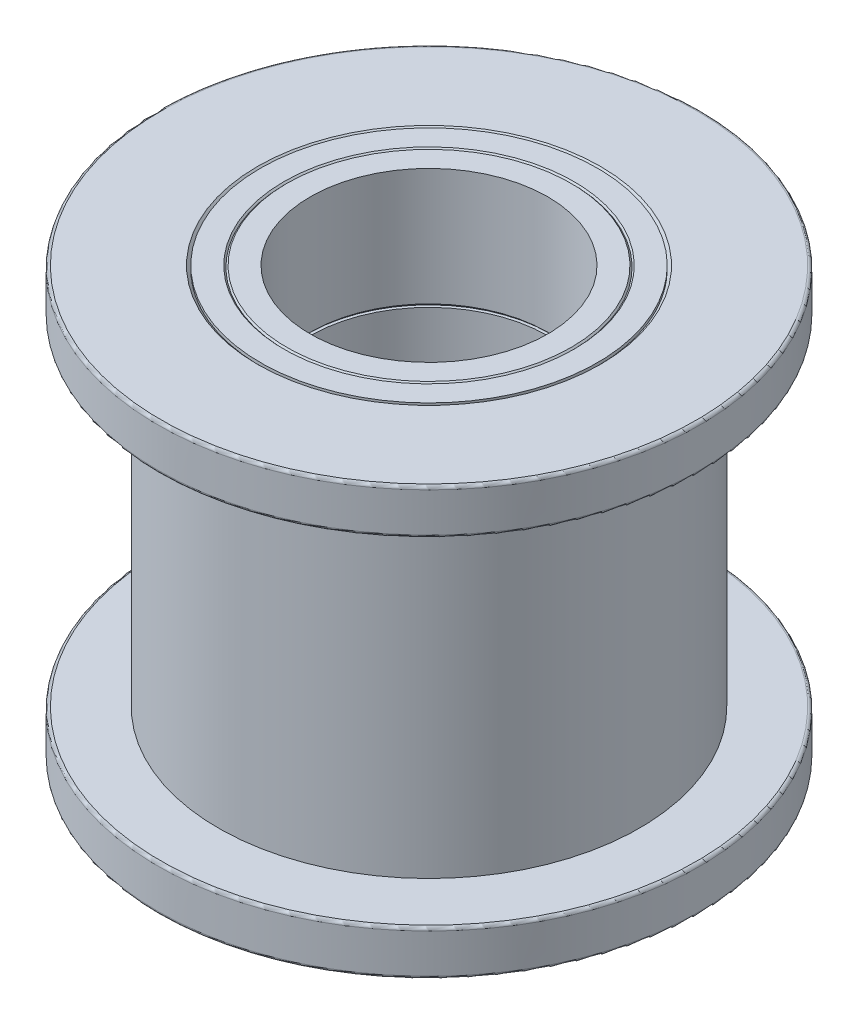
ISO-10303-21;
HEADER;
FILE_DESCRIPTION(('STEP AP214'),'2;1');
FILE_NAME('part.step','',(''),(''),'','','');
FILE_SCHEMA(('AUTOMOTIVE_DESIGN { 1 0 10303 214 1 1 1 1 }'));
ENDSEC;
DATA;
#1=APPLICATION_CONTEXT('core data for automotive mechanical design processes');
#2=APPLICATION_PROTOCOL_DEFINITION('international standard','automotive_design',2000,#1);
#3=PRODUCT_CONTEXT('',#1,'mechanical');
#4=PRODUCT('Part','Part','',(#3));
#5=PRODUCT_RELATED_PRODUCT_CATEGORY('part','',(#4));
#6=PRODUCT_DEFINITION_FORMATION('','',#4);
#7=PRODUCT_DEFINITION_CONTEXT('part definition',#1,'design');
#8=PRODUCT_DEFINITION('design','',#6,#7);
#9=PRODUCT_DEFINITION_SHAPE('','',#8);
#10=(LENGTH_UNIT() NAMED_UNIT(*) SI_UNIT(.MILLI.,.METRE.));
#11=(NAMED_UNIT(*) PLANE_ANGLE_UNIT() SI_UNIT($,.RADIAN.));
#12=(NAMED_UNIT(*) SI_UNIT($,.STERADIAN.) SOLID_ANGLE_UNIT());
#13=UNCERTAINTY_MEASURE_WITH_UNIT(LENGTH_MEASURE(1.E-05),#10,'distance_accuracy_value','');
#14=(GEOMETRIC_REPRESENTATION_CONTEXT(3) GLOBAL_UNCERTAINTY_ASSIGNED_CONTEXT((#13)) GLOBAL_UNIT_ASSIGNED_CONTEXT((#10,
#11,#12)) REPRESENTATION_CONTEXT('',''));
#15=CARTESIAN_POINT('',(0.,0.,0.));
#16=DIRECTION('',(0.,0.,1.));
#17=DIRECTION('',(1.,0.,0.));
#18=AXIS2_PLACEMENT_3D('',#15,#16,#17);
#19=CARTESIAN_POINT('',(0.,4.,0.));
#20=DIRECTION('',(0.,-1.,0.));
#21=DIRECTION('',(-1.,0.,0.));
#22=AXIS2_PLACEMENT_3D('',#19,#20,#21);
#23=PLANE('',#22);
#24=CARTESIAN_POINT('',(0.,4.,0.));
#25=DIRECTION('',(0.,1.,0.));
#26=DIRECTION('',(0.,0.,1.));
#27=AXIS2_PLACEMENT_3D('',#24,#25,#26);
#28=CIRCLE('',#27,3.95);
#29=CARTESIAN_POINT('',(0.,4.,-3.95));
#30=VERTEX_POINT('',#29);
#31=EDGE_CURVE('P0_E58',#30,#30,#28,.T.);
#32=ORIENTED_EDGE('',*,*,#31,.T.);
#33=EDGE_LOOP('',(#32));
#34=FACE_BOUND('',#33,.T.);
#35=CARTESIAN_POINT('',(0.,4.,0.));
#36=DIRECTION('',(0.,-1.,0.));
#37=DIRECTION('',(1.,0.,0.));
#38=AXIS2_PLACEMENT_3D('',#35,#36,#37);
#39=CIRCLE('',#38,5.6);
#40=CARTESIAN_POINT('',(-5.6,4.,0.));
#41=VERTEX_POINT('',#40);
#42=EDGE_CURVE('P0_E11',#41,#41,#39,.T.);
#43=ORIENTED_EDGE('',*,*,#42,.T.);
#44=EDGE_LOOP('',(#43));
#45=FACE_BOUND('',#44,.T.);
#46=ADVANCED_FACE('P0_F17',(#34,#45),#23,.T.);
#47=CARTESIAN_POINT('',(0.,7.1,0.));
#48=DIRECTION('',(0.,1.,0.));
#49=DIRECTION('',(1.,0.,0.));
#50=AXIS2_PLACEMENT_3D('',#47,#48,#49);
#51=CYLINDRICAL_SURFACE('',#50,5.6);
#52=CARTESIAN_POINT('',(0.,10.2,0.));
#53=DIRECTION('',(0.,1.,0.));
#54=DIRECTION('',(1.,0.,0.));
#55=AXIS2_PLACEMENT_3D('',#52,#53,#54);
#56=CIRCLE('',#55,5.6);
#57=CARTESIAN_POINT('',(-5.6,10.2,0.));
#58=VERTEX_POINT('',#57);
#59=EDGE_CURVE('P0_E65',#58,#58,#56,.T.);
#60=ORIENTED_EDGE('',*,*,#59,.F.);
#61=DIRECTION('',(0.,-1.,0.));
#62=VECTOR('',#61,1.);
#63=CARTESIAN_POINT('',(-5.6,7.1,0.));
#64=LINE('',#63,#62);
#65=EDGE_CURVE('P0_E25',#58,#41,#64,.T.);
#66=ORIENTED_EDGE('',*,*,#65,.T.);
#67=ORIENTED_EDGE('',*,*,#42,.F.);
#68=ORIENTED_EDGE('',*,*,#65,.F.);
#69=EDGE_LOOP('',(#60,#66,#67,#68));
#70=FACE_BOUND('',#69,.T.);
#71=ADVANCED_FACE('P0_F74',(#70),#51,.T.);
#72=CARTESIAN_POINT('',(0.,10.2,0.));
#73=DIRECTION('',(0.,1.,0.));
#74=DIRECTION('',(0.,0.,-1.));
#75=AXIS2_PLACEMENT_3D('',#72,#73,#74);
#76=PLANE('',#75);
#77=CARTESIAN_POINT('',(0.,10.2,0.));
#78=DIRECTION('',(0.,1.,0.));
#79=DIRECTION('',(0.,0.,1.));
#80=AXIS2_PLACEMENT_3D('',#77,#78,#79);
#81=CIRCLE('',#80,3.95);
#82=CARTESIAN_POINT('',(0.,10.2,-3.95));
#83=VERTEX_POINT('',#82);
#84=EDGE_CURVE('P0_E57',#83,#83,#81,.T.);
#85=ORIENTED_EDGE('',*,*,#84,.F.);
#86=EDGE_LOOP('',(#85));
#87=FACE_BOUND('',#86,.T.);
#88=ORIENTED_EDGE('',*,*,#59,.T.);
#89=EDGE_LOOP('',(#88));
#90=FACE_BOUND('',#89,.T.);
#91=ADVANCED_FACE('P0_F76',(#87,#90),#76,.T.);
#92=CARTESIAN_POINT('',(0.,7.1,0.));
#93=DIRECTION('',(0.,-1.,0.));
#94=DIRECTION('',(0.,0.,1.));
#95=AXIS2_PLACEMENT_3D('',#92,#93,#94);
#96=CYLINDRICAL_SURFACE('',#95,3.95);
#97=ORIENTED_EDGE('',*,*,#84,.T.);
#98=DIRECTION('',(0.,-1.,0.));
#99=VECTOR('',#98,1.);
#100=CARTESIAN_POINT('',(0.,7.1,-3.95));
#101=LINE('',#100,#99);
#102=EDGE_CURVE('P0_E54',#83,#30,#101,.T.);
#103=ORIENTED_EDGE('',*,*,#102,.T.);
#104=ORIENTED_EDGE('',*,*,#31,.F.);
#105=ORIENTED_EDGE('',*,*,#102,.F.);
#106=EDGE_LOOP('',(#97,#103,#104,#105));
#107=FACE_BOUND('',#106,.T.);
#108=ADVANCED_FACE('P0_F55',(#107),#96,.F.);
#109=CLOSED_SHELL('',(#46,#71,#91,#108));
#110=MANIFOLD_SOLID_BREP('P0_B1',#109);
#111=CARTESIAN_POINT('',(0.,14.2,0.));
#112=DIRECTION('',(0.,1.,0.));
#113=DIRECTION('',(0.,0.,-1.));
#114=AXIS2_PLACEMENT_3D('',#111,#112,#113);
#115=PLANE('',#114);
#116=CARTESIAN_POINT('',(0.,14.2,0.));
#117=DIRECTION('',(0.,-1.,0.));
#118=DIRECTION('',(0.,0.,1.));
#119=AXIS2_PLACEMENT_3D('',#116,#117,#118);
#120=CIRCLE('',#119,3.95);
#121=CARTESIAN_POINT('',(0.,14.2,-3.95));
#122=VERTEX_POINT('',#121);
#123=EDGE_CURVE('P1_E62',#122,#122,#120,.T.);
#124=ORIENTED_EDGE('',*,*,#123,.T.);
#125=EDGE_LOOP('',(#124));
#126=FACE_BOUND('',#125,.T.);
#127=CARTESIAN_POINT('',(0.,14.2,0.));
#128=DIRECTION('',(0.,-1.,0.));
#129=DIRECTION('',(-1.,0.,0.));
#130=AXIS2_PLACEMENT_3D('',#127,#128,#129);
#131=CIRCLE('',#130,4.72462639589585);
#132=CARTESIAN_POINT('',(4.72462639589585,14.2,0.));
#133=VERTEX_POINT('',#132);
#134=EDGE_CURVE('P1_E11',#133,#133,#131,.T.);
#135=ORIENTED_EDGE('',*,*,#134,.F.);
#136=EDGE_LOOP('',(#135));
#137=FACE_BOUND('',#136,.T.);
#138=ADVANCED_FACE('P1_F17',(#126,#137),#115,.T.);
#139=CARTESIAN_POINT('',(0.,14.175,0.));
#140=DIRECTION('',(0.,-1.,0.));
#141=DIRECTION('',(-1.,0.,0.));
#142=AXIS2_PLACEMENT_3D('',#139,#140,#141);
#143=CONICAL_SURFACE('',#142,4.74962639589585,0.785398163397459);
#144=CARTESIAN_POINT('',(0.,14.15,0.));
#145=DIRECTION('',(0.,1.,0.));
#146=DIRECTION('',(-1.,0.,0.));
#147=AXIS2_PLACEMENT_3D('',#144,#145,#146);
#148=CIRCLE('',#147,4.77462639589585);
#149=CARTESIAN_POINT('',(4.77462639589585,14.15,0.));
#150=VERTEX_POINT('',#149);
#151=EDGE_CURVE('P1_E64',#150,#150,#148,.T.);
#152=ORIENTED_EDGE('',*,*,#151,.T.);
#153=DIRECTION('',(-0.707106781186555,0.70710678118654,0.));
#154=VECTOR('',#153,1.);
#155=CARTESIAN_POINT('',(4.74962639589585,14.175,0.));
#156=LINE('',#155,#154);
#157=EDGE_CURVE('P1_E26',#150,#133,#156,.T.);
#158=ORIENTED_EDGE('',*,*,#157,.T.);
#159=ORIENTED_EDGE('',*,*,#134,.T.);
#160=ORIENTED_EDGE('',*,*,#157,.F.);
#161=EDGE_LOOP('',(#152,#158,#159,#160));
#162=FACE_BOUND('',#161,.T.);
#163=ADVANCED_FACE('P1_F96',(#162),#143,.T.);
#164=CARTESIAN_POINT('',(0.,14.2,0.));
#165=DIRECTION('',(0.,1.,0.));
#166=DIRECTION('',(-1.,0.,0.));
#167=AXIS2_PLACEMENT_3D('',#164,#165,#166);
#168=CYLINDRICAL_SURFACE('',#167,4.77462639589585);
#169=ORIENTED_EDGE('',*,*,#151,.F.);
#170=DIRECTION('',(0.,-1.,0.));
#171=VECTOR('',#170,1.);
#172=CARTESIAN_POINT('',(4.77462639589585,14.2,0.));
#173=LINE('',#172,#171);
#174=CARTESIAN_POINT('',(4.77462639589585,10.2,0.));
#175=VERTEX_POINT('',#174);
#176=EDGE_CURVE('P1_E91',#150,#175,#173,.T.);
#177=ORIENTED_EDGE('',*,*,#176,.T.);
#178=CARTESIAN_POINT('',(0.,10.2,0.));
#179=DIRECTION('',(0.,1.,0.));
#180=DIRECTION('',(-1.,0.,0.));
#181=AXIS2_PLACEMENT_3D('',#178,#179,#180);
#182=CIRCLE('',#181,4.77462639589585);
#183=EDGE_CURVE('P1_E79',#175,#175,#182,.T.);
#184=ORIENTED_EDGE('',*,*,#183,.T.);
#185=ORIENTED_EDGE('',*,*,#176,.F.);
#186=EDGE_LOOP('',(#169,#177,#184,#185));
#187=FACE_BOUND('',#186,.T.);
#188=ADVANCED_FACE('P1_F100',(#187),#168,.T.);
#189=CARTESIAN_POINT('',(0.,7.1,0.));
#190=DIRECTION('',(0.,-1.,0.));
#191=DIRECTION('',(0.,0.,1.));
#192=AXIS2_PLACEMENT_3D('',#189,#190,#191);
#193=CYLINDRICAL_SURFACE('',#192,3.95);
#194=ORIENTED_EDGE('',*,*,#123,.F.);
#195=DIRECTION('',(0.,-1.,0.));
#196=VECTOR('',#195,1.);
#197=CARTESIAN_POINT('',(0.,7.1,-3.95));
#198=LINE('',#197,#196);
#199=CARTESIAN_POINT('',(0.,10.3,-3.95));
#200=VERTEX_POINT('',#199);
#201=EDGE_CURVE('P1_E56',#122,#200,#198,.T.);
#202=ORIENTED_EDGE('',*,*,#201,.T.);
#203=CARTESIAN_POINT('',(0.,10.3,0.));
#204=DIRECTION('',(0.,1.,0.));
#205=DIRECTION('',(0.,0.,1.));
#206=AXIS2_PLACEMENT_3D('',#203,#204,#205);
#207=CIRCLE('',#206,3.95);
#208=EDGE_CURVE('P1_E60',#200,#200,#207,.T.);
#209=ORIENTED_EDGE('',*,*,#208,.F.);
#210=ORIENTED_EDGE('',*,*,#201,.F.);
#211=EDGE_LOOP('',(#194,#202,#209,#210));
#212=FACE_BOUND('',#211,.T.);
#213=ADVANCED_FACE('P1_F58',(#212),#193,.F.);
#214=CARTESIAN_POINT('',(0.,10.2,0.));
#215=DIRECTION('',(0.,1.,0.));
#216=DIRECTION('',(0.,0.,-1.));
#217=AXIS2_PLACEMENT_3D('',#214,#215,#216);
#218=PLANE('',#217);
#219=CARTESIAN_POINT('',(0.,10.2,0.));
#220=DIRECTION('',(0.,-1.,0.));
#221=DIRECTION('',(0.,0.,1.));
#222=AXIS2_PLACEMENT_3D('',#219,#220,#221);
#223=CIRCLE('',#222,4.05);
#224=CARTESIAN_POINT('',(0.,10.2,-4.05));
#225=VERTEX_POINT('',#224);
#226=EDGE_CURVE('P1_E71',#225,#225,#223,.T.);
#227=ORIENTED_EDGE('',*,*,#226,.F.);
#228=EDGE_LOOP('',(#227));
#229=FACE_BOUND('',#228,.T.);
#230=ORIENTED_EDGE('',*,*,#183,.F.);
#231=EDGE_LOOP('',(#230));
#232=FACE_BOUND('',#231,.T.);
#233=ADVANCED_FACE('P1_F103',(#229,#232),#218,.F.);
#234=CARTESIAN_POINT('',(0.,10.25,0.));
#235=DIRECTION('',(0.,-1.,0.));
#236=DIRECTION('',(0.,0.,1.));
#237=AXIS2_PLACEMENT_3D('',#234,#235,#236);
#238=CONICAL_SURFACE('',#237,4.,0.785398163397459);
#239=ORIENTED_EDGE('',*,*,#208,.T.);
#240=DIRECTION('',(0.,-0.70710678118654,-0.707106781186555));
#241=VECTOR('',#240,1.);
#242=CARTESIAN_POINT('',(0.,10.25,-4.));
#243=LINE('',#242,#241);
#244=EDGE_CURVE('P1_E68',#200,#225,#243,.T.);
#245=ORIENTED_EDGE('',*,*,#244,.T.);
#246=ORIENTED_EDGE('',*,*,#226,.T.);
#247=ORIENTED_EDGE('',*,*,#244,.F.);
#248=EDGE_LOOP('',(#239,#245,#246,#247));
#249=FACE_BOUND('',#248,.T.);
#250=ADVANCED_FACE('P1_F69',(#249),#238,.F.);
#251=CLOSED_SHELL('',(#138,#163,#188,#213,#233,#250));
#252=MANIFOLD_SOLID_BREP('P1_B1',#251);
#253=CARTESIAN_POINT('',(0.,14.2,0.));
#254=DIRECTION('',(0.,1.,0.));
#255=DIRECTION('',(0.,0.,-1.));
#256=AXIS2_PLACEMENT_3D('',#253,#254,#255);
#257=PLANE('',#256);
#258=CARTESIAN_POINT('',(0.,14.2,0.));
#259=DIRECTION('',(0.,1.,0.));
#260=DIRECTION('',(-1.,0.,0.));
#261=AXIS2_PLACEMENT_3D('',#258,#259,#260);
#262=CIRCLE('',#261,4.82462639589585);
#263=CARTESIAN_POINT('',(4.82462639589585,14.2,0.));
#264=VERTEX_POINT('',#263);
#265=EDGE_CURVE('P2_E26',#264,#264,#262,.T.);
#266=ORIENTED_EDGE('',*,*,#265,.F.);
#267=EDGE_LOOP('',(#266));
#268=FACE_BOUND('',#267,.T.);
#269=CARTESIAN_POINT('',(0.,14.2,0.));
#270=DIRECTION('',(0.,1.,0.));
#271=DIRECTION('',(1.,0.,0.));
#272=AXIS2_PLACEMENT_3D('',#269,#270,#271);
#273=CIRCLE('',#272,5.6);
#274=CARTESIAN_POINT('',(-5.6,14.2,0.));
#275=VERTEX_POINT('',#274);
#276=EDGE_CURVE('P2_E61',#275,#275,#273,.T.);
#277=ORIENTED_EDGE('',*,*,#276,.T.);
#278=EDGE_LOOP('',(#277));
#279=FACE_BOUND('',#278,.T.);
#280=ADVANCED_FACE('P2_F17',(#268,#279),#257,.T.);
#281=CARTESIAN_POINT('',(0.,14.175,0.));
#282=DIRECTION('',(0.,1.,0.));
#283=DIRECTION('',(-1.,0.,0.));
#284=AXIS2_PLACEMENT_3D('',#281,#282,#283);
#285=CONICAL_SURFACE('',#284,4.79962639589585,0.785398163397459);
#286=ORIENTED_EDGE('',*,*,#265,.T.);
#287=DIRECTION('',(-0.707106781186555,-0.70710678118654,0.));
#288=VECTOR('',#287,1.);
#289=CARTESIAN_POINT('',(4.79962639589585,14.175,0.));
#290=LINE('',#289,#288);
#291=CARTESIAN_POINT('',(4.77462639589585,14.15,0.));
#292=VERTEX_POINT('',#291);
#293=EDGE_CURVE('P2_E11',#264,#292,#290,.T.);
#294=ORIENTED_EDGE('',*,*,#293,.T.);
#295=CARTESIAN_POINT('',(0.,14.15,0.));
#296=DIRECTION('',(0.,-1.,0.));
#297=DIRECTION('',(-1.,0.,0.));
#298=AXIS2_PLACEMENT_3D('',#295,#296,#297);
#299=CIRCLE('',#298,4.77462639589585);
#300=EDGE_CURVE('P2_E70',#292,#292,#299,.T.);
#301=ORIENTED_EDGE('',*,*,#300,.T.);
#302=ORIENTED_EDGE('',*,*,#293,.F.);
#303=EDGE_LOOP('',(#286,#294,#301,#302));
#304=FACE_BOUND('',#303,.T.);
#305=ADVANCED_FACE('P2_F82',(#304),#285,.F.);
#306=CARTESIAN_POINT('',(0.,14.2,0.));
#307=DIRECTION('',(0.,1.,0.));
#308=DIRECTION('',(-1.,0.,0.));
#309=AXIS2_PLACEMENT_3D('',#306,#307,#308);
#310=CYLINDRICAL_SURFACE('',#309,4.77462639589585);
#311=CARTESIAN_POINT('',(0.,10.2,0.));
#312=DIRECTION('',(0.,-1.,0.));
#313=DIRECTION('',(-1.,0.,0.));
#314=AXIS2_PLACEMENT_3D('',#311,#312,#313);
#315=CIRCLE('',#314,4.77462639589585);
#316=CARTESIAN_POINT('',(4.77462639589585,10.2,0.));
#317=VERTEX_POINT('',#316);
#318=EDGE_CURVE('P2_E71',#317,#317,#315,.T.);
#319=ORIENTED_EDGE('',*,*,#318,.T.);
#320=DIRECTION('',(0.,1.,0.));
#321=VECTOR('',#320,1.);
#322=CARTESIAN_POINT('',(4.77462639589585,14.2,0.));
#323=LINE('',#322,#321);
#324=EDGE_CURVE('P2_E20',#317,#292,#323,.T.);
#325=ORIENTED_EDGE('',*,*,#324,.T.);
#326=ORIENTED_EDGE('',*,*,#300,.F.);
#327=ORIENTED_EDGE('',*,*,#324,.F.);
#328=EDGE_LOOP('',(#319,#325,#326,#327));
#329=FACE_BOUND('',#328,.T.);
#330=ADVANCED_FACE('P2_F85',(#329),#310,.F.);
#331=CARTESIAN_POINT('',(0.,7.1,0.));
#332=DIRECTION('',(0.,1.,0.));
#333=DIRECTION('',(1.,0.,0.));
#334=AXIS2_PLACEMENT_3D('',#331,#332,#333);
#335=CYLINDRICAL_SURFACE('',#334,5.6);
#336=ORIENTED_EDGE('',*,*,#276,.F.);
#337=DIRECTION('',(0.,-1.,0.));
#338=VECTOR('',#337,1.);
#339=CARTESIAN_POINT('',(-5.6,7.1,0.));
#340=LINE('',#339,#338);
#341=CARTESIAN_POINT('',(-5.6,10.2,0.));
#342=VERTEX_POINT('',#341);
#343=EDGE_CURVE('P2_E56',#275,#342,#340,.T.);
#344=ORIENTED_EDGE('',*,*,#343,.T.);
#345=CARTESIAN_POINT('',(0.,10.2,0.));
#346=DIRECTION('',(0.,1.,0.));
#347=DIRECTION('',(1.,0.,0.));
#348=AXIS2_PLACEMENT_3D('',#345,#346,#347);
#349=CIRCLE('',#348,5.6);
#350=EDGE_CURVE('P2_E59',#342,#342,#349,.T.);
#351=ORIENTED_EDGE('',*,*,#350,.T.);
#352=ORIENTED_EDGE('',*,*,#343,.F.);
#353=EDGE_LOOP('',(#336,#344,#351,#352));
#354=FACE_BOUND('',#353,.T.);
#355=ADVANCED_FACE('P2_F57',(#354),#335,.T.);
#356=CARTESIAN_POINT('',(0.,10.2,0.));
#357=DIRECTION('',(0.,1.,0.));
#358=DIRECTION('',(0.,0.,-1.));
#359=AXIS2_PLACEMENT_3D('',#356,#357,#358);
#360=PLANE('',#359);
#361=ORIENTED_EDGE('',*,*,#318,.F.);
#362=EDGE_LOOP('',(#361));
#363=FACE_BOUND('',#362,.T.);
#364=ORIENTED_EDGE('',*,*,#350,.F.);
#365=EDGE_LOOP('',(#364));
#366=FACE_BOUND('',#365,.T.);
#367=ADVANCED_FACE('P2_F115',(#363,#366),#360,.F.);
#368=CLOSED_SHELL('',(#280,#305,#330,#355,#367));
#369=MANIFOLD_SOLID_BREP('P2_B1',#368);
#370=CARTESIAN_POINT('',(0.,14.2,0.));
#371=DIRECTION('',(0.,1.,0.));
#372=DIRECTION('',(-1.,0.,0.));
#373=AXIS2_PLACEMENT_3D('',#370,#371,#372);
#374=CYLINDRICAL_SURFACE('',#373,4.77462639589585);
#375=CARTESIAN_POINT('',(0.,4.,0.));
#376=DIRECTION('',(0.,-1.,0.));
#377=DIRECTION('',(-1.,0.,0.));
#378=AXIS2_PLACEMENT_3D('',#375,#376,#377);
#379=CIRCLE('',#378,4.77462639589585);
#380=CARTESIAN_POINT('',(4.77462639589585,4.,0.));
#381=VERTEX_POINT('',#380);
#382=EDGE_CURVE('P3_E71',#381,#381,#379,.T.);
#383=ORIENTED_EDGE('',*,*,#382,.T.);
#384=DIRECTION('',(0.,-1.,0.));
#385=VECTOR('',#384,1.);
#386=CARTESIAN_POINT('',(4.77462639589585,14.2,0.));
#387=LINE('',#386,#385);
#388=CARTESIAN_POINT('',(4.77462639589585,0.0499999999999989,0.));
#389=VERTEX_POINT('',#388);
#390=EDGE_CURVE('P3_E11',#381,#389,#387,.T.);
#391=ORIENTED_EDGE('',*,*,#390,.T.);
#392=CARTESIAN_POINT('',(0.,0.0499999999999989,0.));
#393=DIRECTION('',(0.,-1.,0.));
#394=DIRECTION('',(-1.,0.,0.));
#395=AXIS2_PLACEMENT_3D('',#392,#393,#394);
#396=CIRCLE('',#395,4.77462639589585);
#397=EDGE_CURVE('P3_E92',#389,#389,#396,.T.);
#398=ORIENTED_EDGE('',*,*,#397,.F.);
#399=ORIENTED_EDGE('',*,*,#390,.F.);
#400=EDGE_LOOP('',(#383,#391,#398,#399));
#401=FACE_BOUND('',#400,.T.);
#402=ADVANCED_FACE('P3_F17',(#401),#374,.T.);
#403=CARTESIAN_POINT('',(0.,0.0249999999999995,0.));
#404=DIRECTION('',(0.,1.,0.));
#405=DIRECTION('',(-1.,0.,0.));
#406=AXIS2_PLACEMENT_3D('',#403,#404,#405);
#407=CONICAL_SURFACE('',#406,4.74962639589585,0.785398163397459);
#408=ORIENTED_EDGE('',*,*,#397,.T.);
#409=DIRECTION('',(-0.707106781186555,-0.70710678118654,0.));
#410=VECTOR('',#409,1.);
#411=CARTESIAN_POINT('',(4.74962639589585,0.0249999999999995,0.));
#412=LINE('',#411,#410);
#413=CARTESIAN_POINT('',(4.72462639589585,0.,0.));
#414=VERTEX_POINT('',#413);
#415=EDGE_CURVE('P3_E20',#389,#414,#412,.T.);
#416=ORIENTED_EDGE('',*,*,#415,.T.);
#417=CARTESIAN_POINT('',(0.,0.,0.));
#418=DIRECTION('',(0.,1.,0.));
#419=DIRECTION('',(-1.,0.,0.));
#420=AXIS2_PLACEMENT_3D('',#417,#418,#419);
#421=CIRCLE('',#420,4.72462639589585);
#422=EDGE_CURVE('P3_E89',#414,#414,#421,.T.);
#423=ORIENTED_EDGE('',*,*,#422,.T.);
#424=ORIENTED_EDGE('',*,*,#415,.F.);
#425=EDGE_LOOP('',(#408,#416,#423,#424));
#426=FACE_BOUND('',#425,.T.);
#427=ADVANCED_FACE('P3_F102',(#426),#407,.T.);
#428=CARTESIAN_POINT('',(0.,0.,0.));
#429=DIRECTION('',(0.,-1.,0.));
#430=DIRECTION('',(-1.,0.,0.));
#431=AXIS2_PLACEMENT_3D('',#428,#429,#430);
#432=PLANE('',#431);
#433=CARTESIAN_POINT('',(0.,0.,0.));
#434=DIRECTION('',(0.,1.,0.));
#435=DIRECTION('',(0.,0.,1.));
#436=AXIS2_PLACEMENT_3D('',#433,#434,#435);
#437=CIRCLE('',#436,3.95);
#438=CARTESIAN_POINT('',(0.,0.,-3.95));
#439=VERTEX_POINT('',#438);
#440=EDGE_CURVE('P3_E69',#439,#439,#437,.T.);
#441=ORIENTED_EDGE('',*,*,#440,.T.);
#442=EDGE_LOOP('',(#441));
#443=FACE_BOUND('',#442,.T.);
#444=ORIENTED_EDGE('',*,*,#422,.F.);
#445=EDGE_LOOP('',(#444));
#446=FACE_BOUND('',#445,.T.);
#447=ADVANCED_FACE('P3_F99',(#443,#446),#432,.T.);
#448=CARTESIAN_POINT('',(0.,7.1,0.));
#449=DIRECTION('',(0.,-1.,0.));
#450=DIRECTION('',(0.,0.,1.));
#451=AXIS2_PLACEMENT_3D('',#448,#449,#450);
#452=CYLINDRICAL_SURFACE('',#451,3.95);
#453=CARTESIAN_POINT('',(0.,3.9,0.));
#454=DIRECTION('',(0.,-1.,0.));
#455=DIRECTION('',(0.,0.,1.));
#456=AXIS2_PLACEMENT_3D('',#453,#454,#455);
#457=CIRCLE('',#456,3.95);
#458=CARTESIAN_POINT('',(0.,3.9,-3.95));
#459=VERTEX_POINT('',#458);
#460=EDGE_CURVE('P3_E68',#459,#459,#457,.T.);
#461=ORIENTED_EDGE('',*,*,#460,.F.);
#462=DIRECTION('',(0.,-1.,0.));
#463=VECTOR('',#462,1.);
#464=CARTESIAN_POINT('',(0.,7.1,-3.95));
#465=LINE('',#464,#463);
#466=EDGE_CURVE('P3_E64',#459,#439,#465,.T.);
#467=ORIENTED_EDGE('',*,*,#466,.T.);
#468=ORIENTED_EDGE('',*,*,#440,.F.);
#469=ORIENTED_EDGE('',*,*,#466,.F.);
#470=EDGE_LOOP('',(#461,#467,#468,#469));
#471=FACE_BOUND('',#470,.T.);
#472=ADVANCED_FACE('P3_F66',(#471),#452,.F.);
#473=CARTESIAN_POINT('',(0.,4.,0.));
#474=DIRECTION('',(0.,-1.,0.));
#475=DIRECTION('',(-1.,0.,0.));
#476=AXIS2_PLACEMENT_3D('',#473,#474,#475);
#477=PLANE('',#476);
#478=CARTESIAN_POINT('',(0.,4.,0.));
#479=DIRECTION('',(0.,1.,0.));
#480=DIRECTION('',(0.,0.,1.));
#481=AXIS2_PLACEMENT_3D('',#478,#479,#480);
#482=CIRCLE('',#481,4.05);
#483=CARTESIAN_POINT('',(0.,4.,-4.05));
#484=VERTEX_POINT('',#483);
#485=EDGE_CURVE('P3_E77',#484,#484,#482,.T.);
#486=ORIENTED_EDGE('',*,*,#485,.F.);
#487=EDGE_LOOP('',(#486));
#488=FACE_BOUND('',#487,.T.);
#489=ORIENTED_EDGE('',*,*,#382,.F.);
#490=EDGE_LOOP('',(#489));
#491=FACE_BOUND('',#490,.T.);
#492=ADVANCED_FACE('P3_F135',(#488,#491),#477,.F.);
#493=CARTESIAN_POINT('',(0.,3.95,0.));
#494=DIRECTION('',(0.,1.,0.));
#495=DIRECTION('',(0.,0.,1.));
#496=AXIS2_PLACEMENT_3D('',#493,#494,#495);
#497=CONICAL_SURFACE('',#496,4.,0.785398163397448);
#498=ORIENTED_EDGE('',*,*,#460,.T.);
#499=DIRECTION('',(0.,0.707106781186547,-0.707106781186548));
#500=VECTOR('',#499,1.);
#501=CARTESIAN_POINT('',(0.,3.95,-4.));
#502=LINE('',#501,#500);
#503=EDGE_CURVE('P3_E74',#459,#484,#502,.T.);
#504=ORIENTED_EDGE('',*,*,#503,.T.);
#505=ORIENTED_EDGE('',*,*,#485,.T.);
#506=ORIENTED_EDGE('',*,*,#503,.F.);
#507=EDGE_LOOP('',(#498,#504,#505,#506));
#508=FACE_BOUND('',#507,.T.);
#509=ADVANCED_FACE('P3_F75',(#508),#497,.F.);
#510=CLOSED_SHELL('',(#402,#427,#447,#472,#492,#509));
#511=MANIFOLD_SOLID_BREP('P3_B1',#510);
#512=CARTESIAN_POINT('',(0.,7.1,0.));
#513=DIRECTION('',(0.,1.,0.));
#514=DIRECTION('',(1.,0.,0.));
#515=AXIS2_PLACEMENT_3D('',#512,#513,#514);
#516=CYLINDRICAL_SURFACE('',#515,5.6);
#517=CARTESIAN_POINT('',(0.,4.,0.));
#518=DIRECTION('',(0.,-1.,0.));
#519=DIRECTION('',(1.,0.,0.));
#520=AXIS2_PLACEMENT_3D('',#517,#518,#519);
#521=CIRCLE('',#520,5.6);
#522=CARTESIAN_POINT('',(-5.6,4.,0.));
#523=VERTEX_POINT('',#522);
#524=EDGE_CURVE('P4_E74',#523,#523,#521,.T.);
#525=ORIENTED_EDGE('',*,*,#524,.T.);
#526=DIRECTION('',(0.,-1.,0.));
#527=VECTOR('',#526,1.);
#528=CARTESIAN_POINT('',(-5.6,7.1,0.));
#529=LINE('',#528,#527);
#530=CARTESIAN_POINT('',(-5.6,0.0199999999999989,0.));
#531=VERTEX_POINT('',#530);
#532=EDGE_CURVE('P4_E11',#523,#531,#529,.T.);
#533=ORIENTED_EDGE('',*,*,#532,.T.);
#534=CARTESIAN_POINT('',(0.,0.02,0.));
#535=DIRECTION('',(0.,-1.,0.));
#536=DIRECTION('',(-1.,0.,0.));
#537=AXIS2_PLACEMENT_3D('',#534,#535,#536);
#538=CIRCLE('',#537,5.6);
#539=CARTESIAN_POINT('',(5.6,0.02,0.));
#540=VERTEX_POINT('',#539);
#541=EDGE_CURVE('P4_E77',#540,#531,#538,.T.);
#542=ORIENTED_EDGE('',*,*,#541,.F.);
#543=CARTESIAN_POINT('',(0.,0.02,0.));
#544=DIRECTION('',(0.,-1.,0.));
#545=DIRECTION('',(-1.,0.,0.));
#546=AXIS2_PLACEMENT_3D('',#543,#544,#545);
#547=CIRCLE('',#546,5.6);
#548=EDGE_CURVE('P4_E75',#531,#540,#547,.T.);
#549=ORIENTED_EDGE('',*,*,#548,.F.);
#550=ORIENTED_EDGE('',*,*,#532,.F.);
#551=EDGE_LOOP('',(#525,#533,#542,#549,#550));
#552=FACE_BOUND('',#551,.T.);
#553=ADVANCED_FACE('P4_F17',(#552),#516,.T.);
#554=CARTESIAN_POINT('',(0.,14.2,0.));
#555=DIRECTION('',(0.,1.,0.));
#556=DIRECTION('',(-1.,0.,0.));
#557=AXIS2_PLACEMENT_3D('',#554,#555,#556);
#558=CYLINDRICAL_SURFACE('',#557,4.77462639589585);
#559=CARTESIAN_POINT('',(0.,0.0499999999999989,0.));
#560=DIRECTION('',(0.,1.,0.));
#561=DIRECTION('',(-1.,0.,0.));
#562=AXIS2_PLACEMENT_3D('',#559,#560,#561);
#563=CIRCLE('',#562,4.77462639589585);
#564=CARTESIAN_POINT('',(4.77462639589585,0.0499999999999989,0.));
#565=VERTEX_POINT('',#564);
#566=EDGE_CURVE('P4_E96',#565,#565,#563,.T.);
#567=ORIENTED_EDGE('',*,*,#566,.F.);
#568=DIRECTION('',(0.,1.,0.));
#569=VECTOR('',#568,1.);
#570=CARTESIAN_POINT('',(4.77462639589585,14.2,0.));
#571=LINE('',#570,#569);
#572=CARTESIAN_POINT('',(4.77462639589585,4.,0.));
#573=VERTEX_POINT('',#572);
#574=EDGE_CURVE('P4_E26',#565,#573,#571,.T.);
#575=ORIENTED_EDGE('',*,*,#574,.T.);
#576=CARTESIAN_POINT('',(0.,4.,0.));
#577=DIRECTION('',(0.,1.,0.));
#578=DIRECTION('',(-1.,0.,0.));
#579=AXIS2_PLACEMENT_3D('',#576,#577,#578);
#580=CIRCLE('',#579,4.77462639589585);
#581=EDGE_CURVE('P4_E95',#573,#573,#580,.T.);
#582=ORIENTED_EDGE('',*,*,#581,.T.);
#583=ORIENTED_EDGE('',*,*,#574,.F.);
#584=EDGE_LOOP('',(#567,#575,#582,#583));
#585=FACE_BOUND('',#584,.T.);
#586=ADVANCED_FACE('P4_F93',(#585),#558,.F.);
#587=CARTESIAN_POINT('',(0.,0.01,0.));
#588=DIRECTION('',(0.,1.,0.));
#589=DIRECTION('',(-1.,0.,0.));
#590=AXIS2_PLACEMENT_3D('',#587,#588,#589);
#591=CONICAL_SURFACE('',#590,5.59,0.785398163397448);
#592=CARTESIAN_POINT('',(0.,0.,0.));
#593=DIRECTION('',(0.,1.,0.));
#594=DIRECTION('',(-1.,0.,0.));
#595=AXIS2_PLACEMENT_3D('',#592,#593,#594);
#596=CIRCLE('',#595,5.58);
#597=CARTESIAN_POINT('',(5.58,0.,0.));
#598=VERTEX_POINT('',#597);
#599=EDGE_CURVE('P4_E87',#598,#598,#596,.T.);
#600=ORIENTED_EDGE('',*,*,#599,.T.);
#601=DIRECTION('',(0.707106781186548,0.707106781186548,0.));
#602=VECTOR('',#601,1.);
#603=CARTESIAN_POINT('',(5.59,0.01,0.));
#604=LINE('',#603,#602);
#605=EDGE_CURVE('P4_E49',#598,#540,#604,.T.);
#606=ORIENTED_EDGE('',*,*,#605,.T.);
#607=ORIENTED_EDGE('',*,*,#541,.T.);
#608=ORIENTED_EDGE('',*,*,#548,.T.);
#609=ORIENTED_EDGE('',*,*,#605,.F.);
#610=EDGE_LOOP('',(#600,#606,#607,#608,#609));
#611=FACE_BOUND('',#610,.T.);
#612=ADVANCED_FACE('P4_F80',(#611),#591,.T.);
#613=CARTESIAN_POINT('',(0.,0.,0.));
#614=DIRECTION('',(0.,-1.,0.));
#615=DIRECTION('',(-1.,0.,0.));
#616=AXIS2_PLACEMENT_3D('',#613,#614,#615);
#617=PLANE('',#616);
#618=CARTESIAN_POINT('',(0.,0.,0.));
#619=DIRECTION('',(0.,-1.,0.));
#620=DIRECTION('',(-1.,0.,0.));
#621=AXIS2_PLACEMENT_3D('',#618,#619,#620);
#622=CIRCLE('',#621,4.82462639589585);
#623=CARTESIAN_POINT('',(4.82462639589585,0.,0.));
#624=VERTEX_POINT('',#623);
#625=EDGE_CURVE('P4_E101',#624,#624,#622,.T.);
#626=ORIENTED_EDGE('',*,*,#625,.F.);
#627=EDGE_LOOP('',(#626));
#628=FACE_BOUND('',#627,.T.);
#629=ORIENTED_EDGE('',*,*,#599,.F.);
#630=EDGE_LOOP('',(#629));
#631=FACE_BOUND('',#630,.T.);
#632=ADVANCED_FACE('P4_F113',(#628,#631),#617,.T.);
#633=CARTESIAN_POINT('',(0.,0.0249999999999995,0.));
#634=DIRECTION('',(0.,-1.,0.));
#635=DIRECTION('',(-1.,0.,0.));
#636=AXIS2_PLACEMENT_3D('',#633,#634,#635);
#637=CONICAL_SURFACE('',#636,4.79962639589585,0.785398163397459);
#638=ORIENTED_EDGE('',*,*,#625,.T.);
#639=DIRECTION('',(-0.707106781186555,0.70710678118654,0.));
#640=VECTOR('',#639,1.);
#641=CARTESIAN_POINT('',(4.79962639589585,0.0249999999999995,0.));
#642=LINE('',#641,#640);
#643=EDGE_CURVE('P4_E66',#624,#565,#642,.T.);
#644=ORIENTED_EDGE('',*,*,#643,.T.);
#645=ORIENTED_EDGE('',*,*,#566,.T.);
#646=ORIENTED_EDGE('',*,*,#643,.F.);
#647=EDGE_LOOP('',(#638,#644,#645,#646));
#648=FACE_BOUND('',#647,.T.);
#649=ADVANCED_FACE('P4_F99',(#648),#637,.F.);
#650=CARTESIAN_POINT('',(0.,4.,0.));
#651=DIRECTION('',(0.,-1.,0.));
#652=DIRECTION('',(-1.,0.,0.));
#653=AXIS2_PLACEMENT_3D('',#650,#651,#652);
#654=PLANE('',#653);
#655=ORIENTED_EDGE('',*,*,#581,.F.);
#656=EDGE_LOOP('',(#655));
#657=FACE_BOUND('',#656,.T.);
#658=ORIENTED_EDGE('',*,*,#524,.F.);
#659=EDGE_LOOP('',(#658));
#660=FACE_BOUND('',#659,.T.);
#661=ADVANCED_FACE('P4_F123',(#657,#660),#654,.F.);
#662=CLOSED_SHELL('',(#553,#586,#612,#632,#649,#661));
#663=MANIFOLD_SOLID_BREP('P4_B1',#662);
#664=CARTESIAN_POINT('',(0.,7.1,0.));
#665=DIRECTION('',(0.,1.,0.));
#666=DIRECTION('',(1.,0.,0.));
#667=AXIS2_PLACEMENT_3D('',#664,#665,#666);
#668=CYLINDRICAL_SURFACE('',#667,7.);
#669=CARTESIAN_POINT('',(0.,12.7,0.));
#670=DIRECTION('',(0.,1.,0.));
#671=DIRECTION('',(1.,0.,0.));
#672=AXIS2_PLACEMENT_3D('',#669,#670,#671);
#673=CIRCLE('',#672,7.);
#674=CARTESIAN_POINT('',(-7.,12.7,0.));
#675=VERTEX_POINT('',#674);
#676=EDGE_CURVE('P5_E155',#675,#675,#673,.T.);
#677=ORIENTED_EDGE('',*,*,#676,.F.);
#678=DIRECTION('',(0.,-1.,0.));
#679=VECTOR('',#678,1.);
#680=CARTESIAN_POINT('',(-7.,7.1,0.));
#681=LINE('',#680,#679);
#682=CARTESIAN_POINT('',(-7.,1.5,0.));
#683=VERTEX_POINT('',#682);
#684=EDGE_CURVE('P5_E11',#675,#683,#681,.T.);
#685=ORIENTED_EDGE('',*,*,#684,.T.);
#686=CARTESIAN_POINT('',(0.,1.5,0.));
#687=DIRECTION('',(0.,-1.,0.));
#688=DIRECTION('',(1.,0.,0.));
#689=AXIS2_PLACEMENT_3D('',#686,#687,#688);
#690=CIRCLE('',#689,7.);
#691=EDGE_CURVE('P5_E118',#683,#683,#690,.T.);
#692=ORIENTED_EDGE('',*,*,#691,.F.);
#693=ORIENTED_EDGE('',*,*,#684,.F.);
#694=EDGE_LOOP('',(#677,#685,#692,#693));
#695=FACE_BOUND('',#694,.T.);
#696=ADVANCED_FACE('P5_F17',(#695),#668,.T.);
#697=CARTESIAN_POINT('',(0.,14.1,0.));
#698=DIRECTION('',(0.,1.,0.));
#699=DIRECTION('',(0.,0.,1.));
#700=AXIS2_PLACEMENT_3D('',#697,#698,#699);
#701=TOROIDAL_SURFACE('',#700,8.9,0.1);
#702=CARTESIAN_POINT('',(0.,14.2,0.));
#703=DIRECTION('',(0.,-1.,0.));
#704=DIRECTION('',(-1.,0.,0.));
#705=AXIS2_PLACEMENT_3D('',#702,#703,#704);
#706=CIRCLE('',#705,8.9);
#707=CARTESIAN_POINT('',(0.,14.2,-8.9));
#708=VERTEX_POINT('',#707);
#709=EDGE_CURVE('P5_E197',#708,#708,#706,.T.);
#710=ORIENTED_EDGE('',*,*,#709,.T.);
#711=CARTESIAN_POINT('',(0.,14.1,-8.9));
#712=DIRECTION('',(-1.,0.,0.));
#713=DIRECTION('',(0.,0.,-1.));
#714=AXIS2_PLACEMENT_3D('',#711,#712,#713);
#715=CIRCLE('',#714,0.1);
#716=CARTESIAN_POINT('',(0.,14.1,-9.));
#717=VERTEX_POINT('',#716);
#718=EDGE_CURVE('P5_E25',#708,#717,#715,.T.);
#719=ORIENTED_EDGE('',*,*,#718,.T.);
#720=CARTESIAN_POINT('',(0.,14.1,0.));
#721=DIRECTION('',(0.,1.,0.));
#722=DIRECTION('',(-1.,0.,0.));
#723=AXIS2_PLACEMENT_3D('',#720,#721,#722);
#724=CIRCLE('',#723,9.);
#725=CARTESIAN_POINT('',(-9.,14.1,0.));
#726=VERTEX_POINT('',#725);
#727=EDGE_CURVE('P5_E153',#717,#726,#724,.T.);
#728=ORIENTED_EDGE('',*,*,#727,.T.);
#729=CARTESIAN_POINT('',(0.,14.1,0.));
#730=DIRECTION('',(0.,1.,0.));
#731=DIRECTION('',(-1.,0.,0.));
#732=AXIS2_PLACEMENT_3D('',#729,#730,#731);
#733=CIRCLE('',#732,9.);
#734=EDGE_CURVE('P5_E146',#726,#717,#733,.T.);
#735=ORIENTED_EDGE('',*,*,#734,.T.);
#736=ORIENTED_EDGE('',*,*,#718,.F.);
#737=EDGE_LOOP('',(#710,#719,#728,#735,#736));
#738=FACE_BOUND('',#737,.T.);
#739=ADVANCED_FACE('P5_F400',(#738),#701,.T.);
#740=CARTESIAN_POINT('',(0.,12.7,0.));
#741=DIRECTION('',(0.,-1.,0.));
#742=DIRECTION('',(-1.,0.,0.));
#743=AXIS2_PLACEMENT_3D('',#740,#741,#742);
#744=PLANE('',#743);
#745=ORIENTED_EDGE('',*,*,#676,.T.);
#746=EDGE_LOOP('',(#745));
#747=FACE_BOUND('',#746,.T.);
#748=CARTESIAN_POINT('',(0.,12.7,0.));
#749=DIRECTION('',(0.,1.,0.));
#750=DIRECTION('',(1.,0.,0.));
#751=AXIS2_PLACEMENT_3D('',#748,#749,#750);
#752=CIRCLE('',#751,8.9);
#753=CARTESIAN_POINT('',(0.,12.7,8.9));
#754=VERTEX_POINT('',#753);
#755=EDGE_CURVE('P5_E125',#754,#754,#752,.T.);
#756=ORIENTED_EDGE('',*,*,#755,.F.);
#757=EDGE_LOOP('',(#756));
#758=FACE_BOUND('',#757,.T.);
#759=ADVANCED_FACE('P5_F394',(#747,#758),#744,.T.);
#760=CARTESIAN_POINT('',(0.,13.4,0.));
#761=DIRECTION('',(0.,1.,0.));
#762=DIRECTION('',(1.,0.,0.));
#763=AXIS2_PLACEMENT_3D('',#760,#761,#762);
#764=CYLINDRICAL_SURFACE('',#763,9.);
#765=ORIENTED_EDGE('',*,*,#734,.F.);
#766=DIRECTION('',(0.,-1.,0.));
#767=VECTOR('',#766,1.);
#768=CARTESIAN_POINT('',(-9.,13.4,0.));
#769=LINE('',#768,#767);
#770=CARTESIAN_POINT('',(-9.,12.8,0.));
#771=VERTEX_POINT('',#770);
#772=EDGE_CURVE('P5_E150',#726,#771,#769,.T.);
#773=ORIENTED_EDGE('',*,*,#772,.T.);
#774=CARTESIAN_POINT('',(0.,12.8,0.));
#775=DIRECTION('',(0.,-1.,0.));
#776=DIRECTION('',(1.,0.,0.));
#777=AXIS2_PLACEMENT_3D('',#774,#775,#776);
#778=CIRCLE('',#777,9.);
#779=CARTESIAN_POINT('',(0.,12.8,9.));
#780=VERTEX_POINT('',#779);
#781=EDGE_CURVE('P5_E139',#780,#771,#778,.T.);
#782=ORIENTED_EDGE('',*,*,#781,.F.);
#783=CARTESIAN_POINT('',(0.,12.8,0.));
#784=DIRECTION('',(0.,-1.,0.));
#785=DIRECTION('',(1.,0.,0.));
#786=AXIS2_PLACEMENT_3D('',#783,#784,#785);
#787=CIRCLE('',#786,9.);
#788=EDGE_CURVE('P5_E143',#771,#780,#787,.T.);
#789=ORIENTED_EDGE('',*,*,#788,.F.);
#790=ORIENTED_EDGE('',*,*,#772,.F.);
#791=ORIENTED_EDGE('',*,*,#727,.F.);
#792=EDGE_LOOP('',(#765,#773,#782,#789,#790,#791));
#793=FACE_BOUND('',#792,.T.);
#794=ADVANCED_FACE('P5_F399',(#793),#764,.T.);
#795=CARTESIAN_POINT('',(0.,12.8,0.));
#796=DIRECTION('',(0.,-1.,0.));
#797=DIRECTION('',(0.,0.,-1.));
#798=AXIS2_PLACEMENT_3D('',#795,#796,#797);
#799=TOROIDAL_SURFACE('',#798,8.9,0.1);
#800=ORIENTED_EDGE('',*,*,#755,.T.);
#801=CARTESIAN_POINT('',(0.,12.8,8.9));
#802=DIRECTION('',(-1.,0.,0.));
#803=DIRECTION('',(0.,0.,1.));
#804=AXIS2_PLACEMENT_3D('',#801,#802,#803);
#805=CIRCLE('',#804,0.1);
#806=EDGE_CURVE('P5_E135',#754,#780,#805,.T.);
#807=ORIENTED_EDGE('',*,*,#806,.T.);
#808=ORIENTED_EDGE('',*,*,#781,.T.);
#809=ORIENTED_EDGE('',*,*,#788,.T.);
#810=ORIENTED_EDGE('',*,*,#806,.F.);
#811=EDGE_LOOP('',(#800,#807,#808,#809,#810));
#812=FACE_BOUND('',#811,.T.);
#813=ADVANCED_FACE('P5_F409',(#812),#799,.T.);
#814=CARTESIAN_POINT('',(0.,1.5,0.));
#815=DIRECTION('',(0.,1.,0.));
#816=DIRECTION('',(0.,0.,-1.));
#817=AXIS2_PLACEMENT_3D('',#814,#815,#816);
#818=PLANE('',#817);
#819=ORIENTED_EDGE('',*,*,#691,.T.);
#820=EDGE_LOOP('',(#819));
#821=FACE_BOUND('',#820,.T.);
#822=CARTESIAN_POINT('',(0.,1.5,0.));
#823=DIRECTION('',(0.,-1.,0.));
#824=DIRECTION('',(1.,0.,0.));
#825=AXIS2_PLACEMENT_3D('',#822,#823,#824);
#826=CIRCLE('',#825,8.9);
#827=CARTESIAN_POINT('',(0.,1.5,-8.9));
#828=VERTEX_POINT('',#827);
#829=EDGE_CURVE('P5_E113',#828,#828,#826,.T.);
#830=ORIENTED_EDGE('',*,*,#829,.F.);
#831=EDGE_LOOP('',(#830));
#832=FACE_BOUND('',#831,.T.);
#833=ADVANCED_FACE('P5_F382',(#821,#832),#818,.T.);
#834=CARTESIAN_POINT('',(0.,1.4,0.));
#835=DIRECTION('',(0.,1.,0.));
#836=DIRECTION('',(0.,0.,1.));
#837=AXIS2_PLACEMENT_3D('',#834,#835,#836);
#838=TOROIDAL_SURFACE('',#837,8.9,0.1);
#839=ORIENTED_EDGE('',*,*,#829,.T.);
#840=CARTESIAN_POINT('',(0.,1.4,-8.9));
#841=DIRECTION('',(-1.,0.,0.));
#842=DIRECTION('',(0.,0.,-1.));
#843=AXIS2_PLACEMENT_3D('',#840,#841,#842);
#844=CIRCLE('',#843,0.1);
#845=CARTESIAN_POINT('',(0.,1.4,-9.));
#846=VERTEX_POINT('',#845);
#847=EDGE_CURVE('P5_E110',#828,#846,#844,.T.);
#848=ORIENTED_EDGE('',*,*,#847,.T.);
#849=CARTESIAN_POINT('',(0.,1.4,0.));
#850=DIRECTION('',(0.,1.,0.));
#851=DIRECTION('',(1.,0.,0.));
#852=AXIS2_PLACEMENT_3D('',#849,#850,#851);
#853=CIRCLE('',#852,9.);
#854=CARTESIAN_POINT('',(-9.,1.4,0.));
#855=VERTEX_POINT('',#854);
#856=EDGE_CURVE('P5_E127',#846,#855,#853,.T.);
#857=ORIENTED_EDGE('',*,*,#856,.T.);
#858=CARTESIAN_POINT('',(0.,1.4,0.));
#859=DIRECTION('',(0.,1.,0.));
#860=DIRECTION('',(1.,0.,0.));
#861=AXIS2_PLACEMENT_3D('',#858,#859,#860);
#862=CIRCLE('',#861,9.);
#863=EDGE_CURVE('P5_E115',#855,#846,#862,.T.);
#864=ORIENTED_EDGE('',*,*,#863,.T.);
#865=ORIENTED_EDGE('',*,*,#847,.F.);
#866=EDGE_LOOP('',(#839,#848,#857,#864,#865));
#867=FACE_BOUND('',#866,.T.);
#868=ADVANCED_FACE('P5_F111',(#867),#838,.T.);
#869=CARTESIAN_POINT('',(0.,0.8,0.));
#870=DIRECTION('',(0.,1.,0.));
#871=DIRECTION('',(1.,0.,0.));
#872=AXIS2_PLACEMENT_3D('',#869,#870,#871);
#873=CYLINDRICAL_SURFACE('',#872,9.);
#874=ORIENTED_EDGE('',*,*,#863,.F.);
#875=DIRECTION('',(0.,-1.,0.));
#876=VECTOR('',#875,1.);
#877=CARTESIAN_POINT('',(-9.,0.8,0.));
#878=LINE('',#877,#876);
#879=CARTESIAN_POINT('',(-9.,0.1,0.));
#880=VERTEX_POINT('',#879);
#881=EDGE_CURVE('P5_E164',#855,#880,#878,.T.);
#882=ORIENTED_EDGE('',*,*,#881,.T.);
#883=CARTESIAN_POINT('',(0.,0.1,0.));
#884=DIRECTION('',(0.,-1.,0.));
#885=DIRECTION('',(-1.,0.,0.));
#886=AXIS2_PLACEMENT_3D('',#883,#884,#885);
#887=CIRCLE('',#886,9.);
#888=CARTESIAN_POINT('',(0.,0.100000000000002,9.));
#889=VERTEX_POINT('',#888);
#890=EDGE_CURVE('P5_E195',#889,#880,#887,.T.);
#891=ORIENTED_EDGE('',*,*,#890,.F.);
#892=CARTESIAN_POINT('',(0.,0.1,0.));
#893=DIRECTION('',(0.,-1.,0.));
#894=DIRECTION('',(-1.,0.,0.));
#895=AXIS2_PLACEMENT_3D('',#892,#893,#894);
#896=CIRCLE('',#895,9.);
#897=EDGE_CURVE('P5_E192',#880,#889,#896,.T.);
#898=ORIENTED_EDGE('',*,*,#897,.F.);
#899=ORIENTED_EDGE('',*,*,#881,.F.);
#900=ORIENTED_EDGE('',*,*,#856,.F.);
#901=EDGE_LOOP('',(#874,#882,#891,#898,#899,#900));
#902=FACE_BOUND('',#901,.T.);
#903=ADVANCED_FACE('P5_F214',(#902),#873,.T.);
#904=CARTESIAN_POINT('',(0.,0.1,0.));
#905=DIRECTION('',(0.,-1.,0.));
#906=DIRECTION('',(0.,0.,-1.));
#907=AXIS2_PLACEMENT_3D('',#904,#905,#906);
#908=TOROIDAL_SURFACE('',#907,8.9,0.1);
#909=CARTESIAN_POINT('',(0.,0.,0.));
#910=DIRECTION('',(0.,1.,0.));
#911=DIRECTION('',(-1.,0.,0.));
#912=AXIS2_PLACEMENT_3D('',#909,#910,#911);
#913=CIRCLE('',#912,8.9);
#914=CARTESIAN_POINT('',(0.,0.,8.9));
#915=VERTEX_POINT('',#914);
#916=EDGE_CURVE('P5_E170',#915,#915,#913,.T.);
#917=ORIENTED_EDGE('',*,*,#916,.T.);
#918=CARTESIAN_POINT('',(0.,0.100000000000002,8.9));
#919=DIRECTION('',(-1.,0.,0.));
#920=DIRECTION('',(0.,0.,1.));
#921=AXIS2_PLACEMENT_3D('',#918,#919,#920);
#922=CIRCLE('',#921,0.1);
#923=EDGE_CURVE('P5_E201',#915,#889,#922,.T.);
#924=ORIENTED_EDGE('',*,*,#923,.T.);
#925=ORIENTED_EDGE('',*,*,#890,.T.);
#926=ORIENTED_EDGE('',*,*,#897,.T.);
#927=ORIENTED_EDGE('',*,*,#923,.F.);
#928=EDGE_LOOP('',(#917,#924,#925,#926,#927));
#929=FACE_BOUND('',#928,.T.);
#930=ADVANCED_FACE('P5_F211',(#929),#908,.T.);
#931=CARTESIAN_POINT('',(0.,14.2,0.));
#932=DIRECTION('',(0.,1.,0.));
#933=DIRECTION('',(0.,0.,-1.));
#934=AXIS2_PLACEMENT_3D('',#931,#932,#933);
#935=PLANE('',#934);
#936=CARTESIAN_POINT('',(0.,14.2,0.));
#937=DIRECTION('',(0.,1.,0.));
#938=DIRECTION('',(-1.,0.,0.));
#939=AXIS2_PLACEMENT_3D('',#936,#937,#938);
#940=CIRCLE('',#939,5.7);
#941=CARTESIAN_POINT('',(5.7,14.2,0.));
#942=VERTEX_POINT('',#941);
#943=EDGE_CURVE('P5_E191',#942,#942,#940,.T.);
#944=ORIENTED_EDGE('',*,*,#943,.F.);
#945=EDGE_LOOP('',(#944));
#946=FACE_BOUND('',#945,.T.);
#947=ORIENTED_EDGE('',*,*,#709,.F.);
#948=EDGE_LOOP('',(#947));
#949=FACE_BOUND('',#948,.T.);
#950=ADVANCED_FACE('P5_F352',(#946,#949),#935,.T.);
#951=CARTESIAN_POINT('',(0.,14.15,0.));
#952=DIRECTION('',(0.,1.,0.));
#953=DIRECTION('',(-1.,0.,0.));
#954=AXIS2_PLACEMENT_3D('',#951,#952,#953);
#955=CONICAL_SURFACE('',#954,5.65,0.785398163397448);
#956=CARTESIAN_POINT('',(0.,14.1,0.));
#957=DIRECTION('',(0.,-1.,0.));
#958=DIRECTION('',(-1.,0.,0.));
#959=AXIS2_PLACEMENT_3D('',#956,#957,#958);
#960=CIRCLE('',#959,5.6);
#961=CARTESIAN_POINT('',(5.6,14.1,0.));
#962=VERTEX_POINT('',#961);
#963=EDGE_CURVE('P5_E174',#962,#962,#960,.T.);
#964=ORIENTED_EDGE('',*,*,#963,.T.);
#965=DIRECTION('',(0.707106781186548,0.707106781186548,0.));
#966=VECTOR('',#965,1.);
#967=CARTESIAN_POINT('',(5.65,14.15,0.));
#968=LINE('',#967,#966);
#969=EDGE_CURVE('P5_E187',#962,#942,#968,.T.);
#970=ORIENTED_EDGE('',*,*,#969,.T.);
#971=ORIENTED_EDGE('',*,*,#943,.T.);
#972=ORIENTED_EDGE('',*,*,#969,.F.);
#973=EDGE_LOOP('',(#964,#970,#971,#972));
#974=FACE_BOUND('',#973,.T.);
#975=ADVANCED_FACE('P5_F357',(#974),#955,.F.);
#976=CARTESIAN_POINT('',(0.,14.2,0.));
#977=DIRECTION('',(0.,-1.,0.));
#978=DIRECTION('',(-1.,0.,0.));
#979=AXIS2_PLACEMENT_3D('',#976,#977,#978);
#980=CYLINDRICAL_SURFACE('',#979,5.6);
#981=ORIENTED_EDGE('',*,*,#963,.F.);
#982=DIRECTION('',(0.,-1.,0.));
#983=VECTOR('',#982,1.);
#984=CARTESIAN_POINT('',(5.6,14.2,0.));
#985=LINE('',#984,#983);
#986=CARTESIAN_POINT('',(5.6,0.1,0.));
#987=VERTEX_POINT('',#986);
#988=EDGE_CURVE('P5_E184',#962,#987,#985,.T.);
#989=ORIENTED_EDGE('',*,*,#988,.T.);
#990=CARTESIAN_POINT('',(0.,0.1,0.));
#991=DIRECTION('',(0.,1.,0.));
#992=DIRECTION('',(-1.,0.,0.));
#993=AXIS2_PLACEMENT_3D('',#990,#991,#992);
#994=CIRCLE('',#993,5.6);
#995=EDGE_CURVE('P5_E165',#987,#987,#994,.T.);
#996=ORIENTED_EDGE('',*,*,#995,.F.);
#997=ORIENTED_EDGE('',*,*,#988,.F.);
#998=EDGE_LOOP('',(#981,#989,#996,#997));
#999=FACE_BOUND('',#998,.T.);
#1000=ADVANCED_FACE('P5_F339',(#999),#980,.F.);
#1001=CARTESIAN_POINT('',(0.,0.,0.));
#1002=DIRECTION('',(0.,-1.,0.));
#1003=DIRECTION('',(-1.,0.,0.));
#1004=AXIS2_PLACEMENT_3D('',#1001,#1002,#1003);
#1005=PLANE('',#1004);
#1006=CARTESIAN_POINT('',(0.,0.,0.));
#1007=DIRECTION('',(0.,-1.,0.));
#1008=DIRECTION('',(-1.,0.,0.));
#1009=AXIS2_PLACEMENT_3D('',#1006,#1007,#1008);
#1010=CIRCLE('',#1009,5.7);
#1011=CARTESIAN_POINT('',(5.7,0.,0.));
#1012=VERTEX_POINT('',#1011);
#1013=EDGE_CURVE('P5_E175',#1012,#1012,#1010,.T.);
#1014=ORIENTED_EDGE('',*,*,#1013,.F.);
#1015=EDGE_LOOP('',(#1014));
#1016=FACE_BOUND('',#1015,.T.);
#1017=ORIENTED_EDGE('',*,*,#916,.F.);
#1018=EDGE_LOOP('',(#1017));
#1019=FACE_BOUND('',#1018,.T.);
#1020=ADVANCED_FACE('P5_F333',(#1016,#1019),#1005,.T.);
#1021=CARTESIAN_POINT('',(0.,0.05,0.));
#1022=DIRECTION('',(0.,-1.,0.));
#1023=DIRECTION('',(-1.,0.,0.));
#1024=AXIS2_PLACEMENT_3D('',#1021,#1022,#1023);
#1025=CONICAL_SURFACE('',#1024,5.65,0.785398163397448);
#1026=ORIENTED_EDGE('',*,*,#995,.T.);
#1027=DIRECTION('',(0.707106781186548,-0.707106781186548,0.));
#1028=VECTOR('',#1027,1.);
#1029=CARTESIAN_POINT('',(5.65,0.05,0.));
#1030=LINE('',#1029,#1028);
#1031=EDGE_CURVE('P5_E169',#987,#1012,#1030,.T.);
#1032=ORIENTED_EDGE('',*,*,#1031,.T.);
#1033=ORIENTED_EDGE('',*,*,#1013,.T.);
#1034=ORIENTED_EDGE('',*,*,#1031,.F.);
#1035=EDGE_LOOP('',(#1026,#1032,#1033,#1034));
#1036=FACE_BOUND('',#1035,.T.);
#1037=ADVANCED_FACE('P5_F338',(#1036),#1025,.F.);
#1038=CLOSED_SHELL('',(#696,#739,#759,#794,#813,#833,#868,#903,#930,#950,#975,#1000,#1020,#1037));
#1039=MANIFOLD_SOLID_BREP('P5_B1',#1038);
#1040=ADVANCED_BREP_SHAPE_REPRESENTATION('',(#18,#110,#252,#369,#511,#663,#1039),#14);
#1041=SHAPE_DEFINITION_REPRESENTATION(#9,#1040);
ENDSEC;
END-ISO-10303-21;
